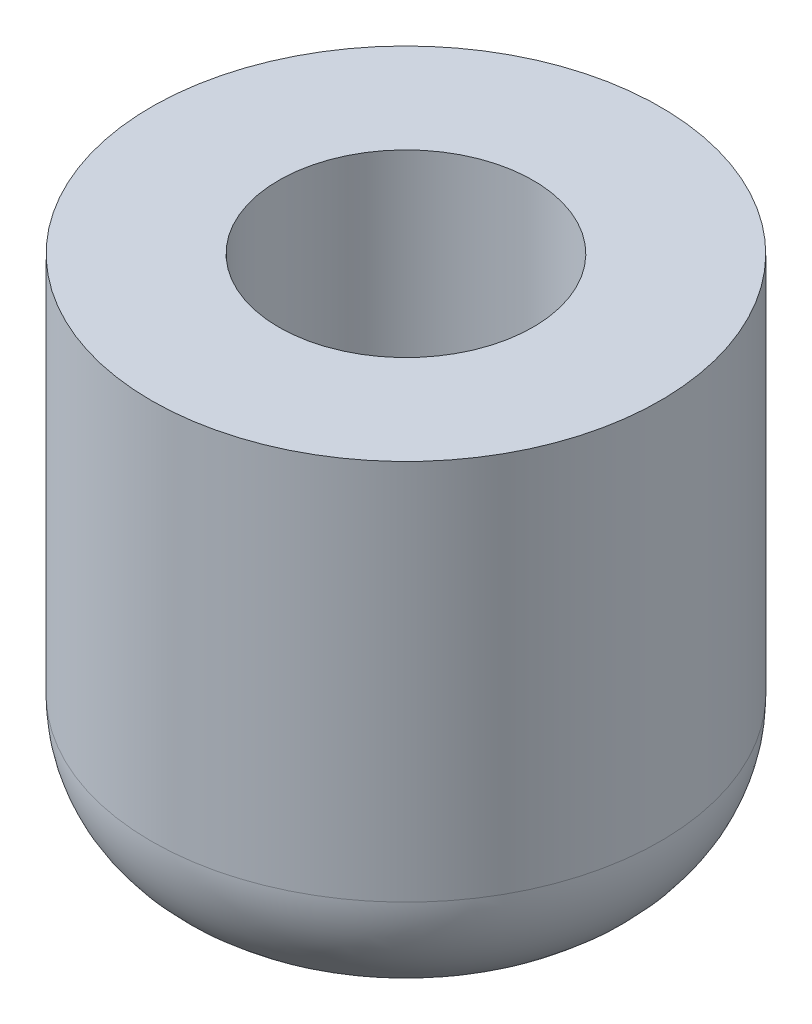
ISO-10303-21;
HEADER;
FILE_DESCRIPTION(('STEP AP214'),'2;1');
FILE_NAME('part.step','',(''),(''),'','','');
FILE_SCHEMA(('AUTOMOTIVE_DESIGN { 1 0 10303 214 1 1 1 1 }'));
ENDSEC;
DATA;
#1=APPLICATION_CONTEXT('core data for automotive mechanical design processes');
#2=APPLICATION_PROTOCOL_DEFINITION('international standard','automotive_design',2000,#1);
#3=PRODUCT_CONTEXT('',#1,'mechanical');
#4=PRODUCT('Part','Part','',(#3));
#5=PRODUCT_RELATED_PRODUCT_CATEGORY('part','',(#4));
#6=PRODUCT_DEFINITION_FORMATION('','',#4);
#7=PRODUCT_DEFINITION_CONTEXT('part definition',#1,'design');
#8=PRODUCT_DEFINITION('design','',#6,#7);
#9=PRODUCT_DEFINITION_SHAPE('','',#8);
#10=(LENGTH_UNIT() NAMED_UNIT(*) SI_UNIT(.MILLI.,.METRE.));
#11=(NAMED_UNIT(*) PLANE_ANGLE_UNIT() SI_UNIT($,.RADIAN.));
#12=(NAMED_UNIT(*) SI_UNIT($,.STERADIAN.) SOLID_ANGLE_UNIT());
#13=UNCERTAINTY_MEASURE_WITH_UNIT(LENGTH_MEASURE(1.E-05),#10,'distance_accuracy_value','');
#14=(GEOMETRIC_REPRESENTATION_CONTEXT(3) GLOBAL_UNCERTAINTY_ASSIGNED_CONTEXT((#13)) GLOBAL_UNIT_ASSIGNED_CONTEXT((#10,
#11,#12)) REPRESENTATION_CONTEXT('',''));
#15=CARTESIAN_POINT('',(0.,0.,0.));
#16=DIRECTION('',(0.,0.,1.));
#17=DIRECTION('',(1.,0.,0.));
#18=AXIS2_PLACEMENT_3D('',#15,#16,#17);
#19=CARTESIAN_POINT('',(0.,6.35,0.));
#20=DIRECTION('',(0.,-1.,0.));
#21=DIRECTION('',(0.,0.,-1.));
#22=AXIS2_PLACEMENT_3D('',#19,#20,#21);
#23=CYLINDRICAL_SURFACE('',#22,6.35);
#24=CARTESIAN_POINT('',(0.,-3.175,0.));
#25=DIRECTION('',(0.,1.,0.));
#26=DIRECTION('',(0.,0.,1.));
#27=AXIS2_PLACEMENT_3D('',#24,#25,#26);
#28=CIRCLE('',#27,6.35);
#29=CARTESIAN_POINT('',(0.,-3.175,6.35));
#30=VERTEX_POINT('',#29);
#31=EDGE_CURVE('E38',#30,#30,#28,.T.);
#32=ORIENTED_EDGE('',*,*,#31,.T.);
#33=EDGE_LOOP('',(#32));
#34=FACE_BOUND('',#33,.T.);
#35=CARTESIAN_POINT('',(0.,6.35,0.));
#36=DIRECTION('',(0.,1.,0.));
#37=DIRECTION('',(0.,0.,1.));
#38=AXIS2_PLACEMENT_3D('',#35,#36,#37);
#39=CIRCLE('',#38,6.35);
#40=CARTESIAN_POINT('',(0.,6.35,6.35));
#41=VERTEX_POINT('',#40);
#42=EDGE_CURVE('E42',#41,#41,#39,.T.);
#43=ORIENTED_EDGE('',*,*,#42,.F.);
#44=EDGE_LOOP('',(#43));
#45=FACE_BOUND('',#44,.T.);
#46=ADVANCED_FACE('F31',(#34,#45),#23,.T.);
#47=CARTESIAN_POINT('',(0.,6.35,0.));
#48=DIRECTION('',(0.,1.,0.));
#49=DIRECTION('',(0.,0.,1.));
#50=AXIS2_PLACEMENT_3D('',#47,#48,#49);
#51=PLANE('',#50);
#52=CARTESIAN_POINT('',(0.,6.35,0.));
#53=DIRECTION('',(0.,1.,0.));
#54=DIRECTION('',(0.,0.,1.));
#55=AXIS2_PLACEMENT_3D('',#52,#53,#54);
#56=CIRCLE('',#55,3.175);
#57=CARTESIAN_POINT('',(0.,6.35,3.175));
#58=VERTEX_POINT('',#57);
#59=EDGE_CURVE('E49',#58,#58,#56,.T.);
#60=ORIENTED_EDGE('',*,*,#59,.F.);
#61=EDGE_LOOP('',(#60));
#62=FACE_BOUND('',#61,.T.);
#63=ORIENTED_EDGE('',*,*,#42,.T.);
#64=EDGE_LOOP('',(#63));
#65=FACE_BOUND('',#64,.T.);
#66=ADVANCED_FACE('F64',(#62,#65),#51,.T.);
#67=CARTESIAN_POINT('',(0.,-6.35,0.));
#68=DIRECTION('',(0.,1.,0.));
#69=DIRECTION('',(0.,0.,1.));
#70=AXIS2_PLACEMENT_3D('',#67,#68,#69);
#71=PLANE('',#70);
#72=CARTESIAN_POINT('',(0.,-6.35,0.));
#73=DIRECTION('',(0.,1.,0.));
#74=DIRECTION('',(0.,0.,1.));
#75=AXIS2_PLACEMENT_3D('',#72,#73,#74);
#76=CIRCLE('',#75,3.175);
#77=CARTESIAN_POINT('',(0.,-6.35,3.175));
#78=VERTEX_POINT('',#77);
#79=EDGE_CURVE('E10',#78,#78,#76,.F.);
#80=ORIENTED_EDGE('',*,*,#79,.T.);
#81=EDGE_LOOP('',(#80));
#82=FACE_BOUND('',#81,.T.);
#83=ADVANCED_FACE('F60',(#82),#71,.F.);
#84=CARTESIAN_POINT('',(0.,0.,0.));
#85=DIRECTION('',(0.,1.,0.));
#86=DIRECTION('',(0.,0.,1.));
#87=AXIS2_PLACEMENT_3D('',#84,#85,#86);
#88=CYLINDRICAL_SURFACE('',#87,3.175);
#89=CARTESIAN_POINT('',(0.,0.,0.));
#90=DIRECTION('',(0.,1.,0.));
#91=DIRECTION('',(0.,0.,1.));
#92=AXIS2_PLACEMENT_3D('',#89,#90,#91);
#93=CIRCLE('',#92,3.175);
#94=CARTESIAN_POINT('',(0.,0.,3.175));
#95=VERTEX_POINT('',#94);
#96=EDGE_CURVE('E46',#95,#95,#93,.T.);
#97=ORIENTED_EDGE('',*,*,#96,.F.);
#98=EDGE_LOOP('',(#97));
#99=FACE_BOUND('',#98,.T.);
#100=ORIENTED_EDGE('',*,*,#59,.T.);
#101=EDGE_LOOP('',(#100));
#102=FACE_BOUND('',#101,.T.);
#103=ADVANCED_FACE('F57',(#99,#102),#88,.F.);
#104=CARTESIAN_POINT('',(0.,0.,0.));
#105=DIRECTION('',(0.,1.,0.));
#106=DIRECTION('',(0.,0.,1.));
#107=AXIS2_PLACEMENT_3D('',#104,#105,#106);
#108=PLANE('',#107);
#109=ORIENTED_EDGE('',*,*,#96,.T.);
#110=EDGE_LOOP('',(#109));
#111=FACE_BOUND('',#110,.T.);
#112=ADVANCED_FACE('F55',(#111),#108,.T.);
#113=CARTESIAN_POINT('',(0.,-3.175,0.));
#114=DIRECTION('',(0.,1.,0.));
#115=DIRECTION('',(0.,0.,1.));
#116=AXIS2_PLACEMENT_3D('',#113,#114,#115);
#117=DEGENERATE_TOROIDAL_SURFACE('',#116,3.175,3.175,.T.);
#118=ORIENTED_EDGE('',*,*,#79,.F.);
#119=EDGE_LOOP('',(#118));
#120=FACE_BOUND('',#119,.T.);
#121=ORIENTED_EDGE('',*,*,#31,.F.);
#122=EDGE_LOOP('',(#121));
#123=FACE_BOUND('',#122,.T.);
#124=ADVANCED_FACE('F33',(#120,#123),#117,.T.);
#125=CLOSED_SHELL('',(#46,#66,#83,#103,#112,#124));
#126=MANIFOLD_SOLID_BREP('B2',#125);
#127=ADVANCED_BREP_SHAPE_REPRESENTATION('',(#18,#126),#14);
#128=SHAPE_DEFINITION_REPRESENTATION(#9,#127);
ENDSEC;
END-ISO-10303-21;
